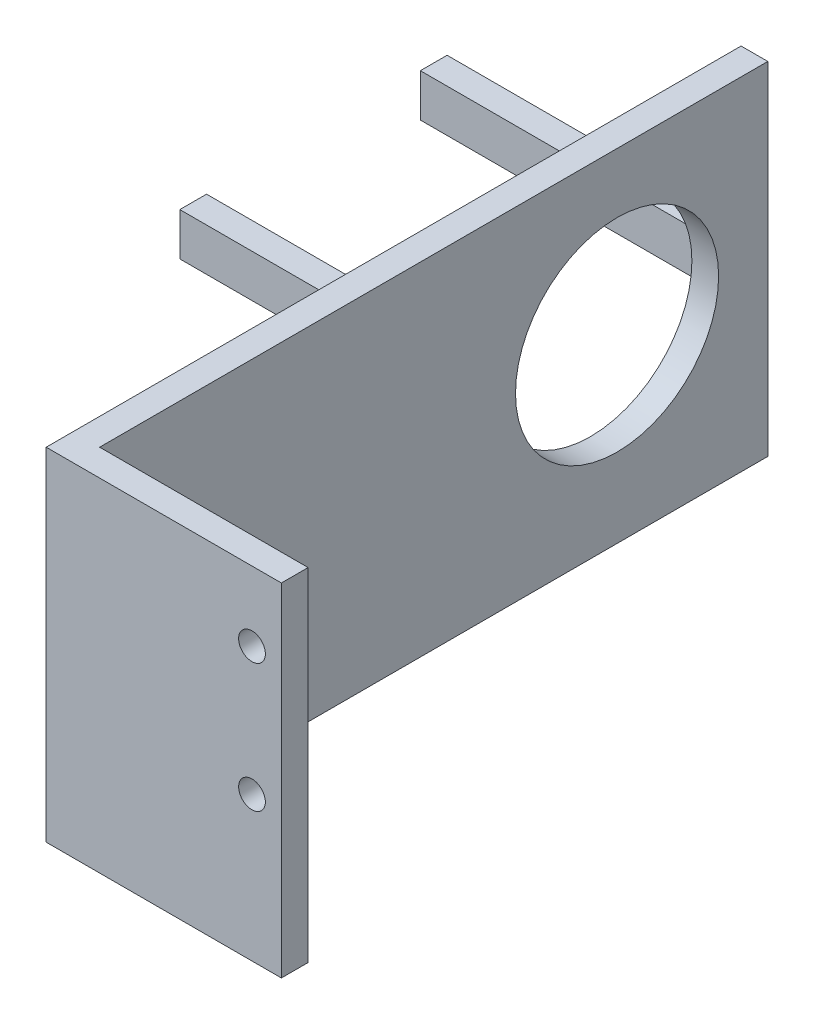
ISO-10303-21;
HEADER;
FILE_DESCRIPTION(('STEP AP214'),'2;1');
FILE_NAME('part.step','',(''),(''),'','','');
FILE_SCHEMA(('AUTOMOTIVE_DESIGN { 1 0 10303 214 1 1 1 1 }'));
ENDSEC;
DATA;
#1=APPLICATION_CONTEXT('core data for automotive mechanical design processes');
#2=APPLICATION_PROTOCOL_DEFINITION('international standard','automotive_design',2000,#1);
#3=PRODUCT_CONTEXT('',#1,'mechanical');
#4=PRODUCT('Part','Part','',(#3));
#5=PRODUCT_RELATED_PRODUCT_CATEGORY('part','',(#4));
#6=PRODUCT_DEFINITION_FORMATION('','',#4);
#7=PRODUCT_DEFINITION_CONTEXT('part definition',#1,'design');
#8=PRODUCT_DEFINITION('design','',#6,#7);
#9=PRODUCT_DEFINITION_SHAPE('','',#8);
#10=(LENGTH_UNIT() NAMED_UNIT(*) SI_UNIT(.MILLI.,.METRE.));
#11=(NAMED_UNIT(*) PLANE_ANGLE_UNIT() SI_UNIT($,.RADIAN.));
#12=(NAMED_UNIT(*) SI_UNIT($,.STERADIAN.) SOLID_ANGLE_UNIT());
#13=UNCERTAINTY_MEASURE_WITH_UNIT(LENGTH_MEASURE(1.E-05),#10,'distance_accuracy_value','');
#14=(GEOMETRIC_REPRESENTATION_CONTEXT(3) GLOBAL_UNCERTAINTY_ASSIGNED_CONTEXT((#13)) GLOBAL_UNIT_ASSIGNED_CONTEXT((#10,
#11,#12)) REPRESENTATION_CONTEXT('',''));
#15=CARTESIAN_POINT('',(0.,0.,0.));
#16=DIRECTION('',(0.,0.,1.));
#17=DIRECTION('',(1.,0.,0.));
#18=AXIS2_PLACEMENT_3D('',#15,#16,#17);
#19=CARTESIAN_POINT('',(-44.,64.,-125.));
#20=DIRECTION('',(-1.,0.,0.));
#21=DIRECTION('',(0.,-1.,0.));
#22=AXIS2_PLACEMENT_3D('',#19,#20,#21);
#23=PLANE('',#22);
#24=CARTESIAN_POINT('',(-44.,33.8,-96.8));
#25=DIRECTION('',(-1.,0.,0.));
#26=DIRECTION('',(0.,-1.,0.));
#27=AXIS2_PLACEMENT_3D('',#24,#25,#26);
#28=CIRCLE('',#27,19.);
#29=CARTESIAN_POINT('',(-44.,14.8,-96.8));
#30=VERTEX_POINT('',#29);
#31=EDGE_CURVE('E197',#30,#30,#28,.T.);
#32=ORIENTED_EDGE('',*,*,#31,.F.);
#33=EDGE_LOOP('',(#32));
#34=FACE_BOUND('',#33,.T.);
#35=DIRECTION('',(0.,-1.,0.));
#36=VECTOR('',#35,1.);
#37=CARTESIAN_POINT('',(-44.,64.,5.));
#38=LINE('',#37,#36);
#39=CARTESIAN_POINT('',(-44.,64.,5.));
#40=VERTEX_POINT('',#39);
#41=CARTESIAN_POINT('',(-44.,0.,5.));
#42=VERTEX_POINT('',#41);
#43=EDGE_CURVE('E203',#40,#42,#38,.T.);
#44=ORIENTED_EDGE('',*,*,#43,.F.);
#45=DIRECTION('',(0.,0.,1.));
#46=VECTOR('',#45,1.);
#47=CARTESIAN_POINT('',(-44.,64.,-125.));
#48=LINE('',#47,#46);
#49=CARTESIAN_POINT('',(-44.,64.,-125.));
#50=VERTEX_POINT('',#49);
#51=EDGE_CURVE('E226',#50,#40,#48,.T.);
#52=ORIENTED_EDGE('',*,*,#51,.F.);
#53=DIRECTION('',(0.,-1.,0.));
#54=VECTOR('',#53,1.);
#55=CARTESIAN_POINT('',(-44.,64.,-125.));
#56=LINE('',#55,#54);
#57=CARTESIAN_POINT('',(-44.,0.,-125.));
#58=VERTEX_POINT('',#57);
#59=EDGE_CURVE('E210',#50,#58,#56,.T.);
#60=ORIENTED_EDGE('',*,*,#59,.T.);
#61=DIRECTION('',(0.,0.,1.));
#62=VECTOR('',#61,1.);
#63=CARTESIAN_POINT('',(-44.,0.,-125.));
#64=LINE('',#63,#62);
#65=EDGE_CURVE('E223',#58,#42,#64,.T.);
#66=ORIENTED_EDGE('',*,*,#65,.T.);
#67=EDGE_LOOP('',(#44,#52,#60,#66));
#68=FACE_BOUND('',#67,.T.);
#69=DIRECTION('',(0.,0.,-1.));
#70=VECTOR('',#69,1.);
#71=CARTESIAN_POINT('',(-44.,38.0000000000007,-72.));
#72=LINE('',#71,#70);
#73=CARTESIAN_POINT('',(-44.,38.0000000000007,-72.));
#74=VERTEX_POINT('',#73);
#75=CARTESIAN_POINT('',(-44.,38.0000000000007,-77.));
#76=VERTEX_POINT('',#75);
#77=EDGE_CURVE('E169',#74,#76,#72,.T.);
#78=ORIENTED_EDGE('',*,*,#77,.F.);
#79=DIRECTION('',(0.,1.,0.));
#80=VECTOR('',#79,1.);
#81=CARTESIAN_POINT('',(-44.,38.0000000000007,-72.));
#82=LINE('',#81,#80);
#83=CARTESIAN_POINT('',(-44.,30.0000000000007,-72.));
#84=VERTEX_POINT('',#83);
#85=EDGE_CURVE('E166',#84,#74,#82,.T.);
#86=ORIENTED_EDGE('',*,*,#85,.F.);
#87=DIRECTION('',(0.,0.,1.));
#88=VECTOR('',#87,1.);
#89=CARTESIAN_POINT('',(-44.,30.0000000000007,-72.));
#90=LINE('',#89,#88);
#91=CARTESIAN_POINT('',(-44.,30.0000000000007,-77.));
#92=VERTEX_POINT('',#91);
#93=EDGE_CURVE('E178',#92,#84,#90,.T.);
#94=ORIENTED_EDGE('',*,*,#93,.F.);
#95=DIRECTION('',(0.,-1.,0.));
#96=VECTOR('',#95,1.);
#97=CARTESIAN_POINT('',(-44.,38.0000000000007,-77.));
#98=LINE('',#97,#96);
#99=EDGE_CURVE('E186',#76,#92,#98,.T.);
#100=ORIENTED_EDGE('',*,*,#99,.F.);
#101=EDGE_LOOP('',(#78,#86,#94,#100));
#102=FACE_BOUND('',#101,.T.);
#103=DIRECTION('',(0.,0.,1.));
#104=VECTOR('',#103,1.);
#105=CARTESIAN_POINT('',(-44.,30.0000000000007,-122.));
#106=LINE('',#105,#104);
#107=CARTESIAN_POINT('',(-44.,30.0000000000007,-122.));
#108=VERTEX_POINT('',#107);
#109=CARTESIAN_POINT('',(-44.,30.0000000000007,-117.));
#110=VERTEX_POINT('',#109);
#111=EDGE_CURVE('E497',#108,#110,#106,.T.);
#112=ORIENTED_EDGE('',*,*,#111,.F.);
#113=DIRECTION('',(0.,-1.,0.));
#114=VECTOR('',#113,1.);
#115=CARTESIAN_POINT('',(-44.,38.0000000000007,-122.));
#116=LINE('',#115,#114);
#117=CARTESIAN_POINT('',(-44.,38.0000000000007,-122.));
#118=VERTEX_POINT('',#117);
#119=EDGE_CURVE('E164',#118,#108,#116,.T.);
#120=ORIENTED_EDGE('',*,*,#119,.F.);
#121=DIRECTION('',(0.,0.,-1.));
#122=VECTOR('',#121,1.);
#123=CARTESIAN_POINT('',(-44.,38.0000000000007,-122.));
#124=LINE('',#123,#122);
#125=CARTESIAN_POINT('',(-44.,38.0000000000007,-117.));
#126=VERTEX_POINT('',#125);
#127=EDGE_CURVE('E160',#126,#118,#124,.T.);
#128=ORIENTED_EDGE('',*,*,#127,.F.);
#129=DIRECTION('',(0.,1.,0.));
#130=VECTOR('',#129,1.);
#131=CARTESIAN_POINT('',(-44.,38.0000000000007,-117.));
#132=LINE('',#131,#130);
#133=EDGE_CURVE('E494',#110,#126,#132,.T.);
#134=ORIENTED_EDGE('',*,*,#133,.F.);
#135=EDGE_LOOP('',(#112,#120,#128,#134));
#136=FACE_BOUND('',#135,.T.);
#137=ADVANCED_FACE('F39',(#34,#68,#102,#136),#23,.T.);
#138=CARTESIAN_POINT('',(0.,0.,5.));
#139=DIRECTION('',(0.,0.,1.));
#140=DIRECTION('',(1.,0.,0.));
#141=AXIS2_PLACEMENT_3D('',#138,#139,#140);
#142=PLANE('',#141);
#143=CARTESIAN_POINT('',(-5.5,51.,5.));
#144=DIRECTION('',(0.,0.,1.));
#145=DIRECTION('',(1.,0.,0.));
#146=AXIS2_PLACEMENT_3D('',#143,#144,#145);
#147=CIRCLE('',#146,2.5);
#148=CARTESIAN_POINT('',(-3.,51.,5.));
#149=VERTEX_POINT('',#148);
#150=EDGE_CURVE('E237',#149,#149,#147,.T.);
#151=ORIENTED_EDGE('',*,*,#150,.F.);
#152=EDGE_LOOP('',(#151));
#153=FACE_BOUND('',#152,.T.);
#154=DIRECTION('',(0.,1.,0.));
#155=VECTOR('',#154,1.);
#156=CARTESIAN_POINT('',(0.,0.,5.));
#157=LINE('',#156,#155);
#158=CARTESIAN_POINT('',(0.,0.,5.));
#159=VERTEX_POINT('',#158);
#160=CARTESIAN_POINT('',(0.,64.,5.));
#161=VERTEX_POINT('',#160);
#162=EDGE_CURVE('E243',#159,#161,#157,.T.);
#163=ORIENTED_EDGE('',*,*,#162,.T.);
#164=DIRECTION('',(-1.,0.,0.));
#165=VECTOR('',#164,1.);
#166=CARTESIAN_POINT('',(0.,64.,5.));
#167=LINE('',#166,#165);
#168=EDGE_CURVE('E246',#161,#40,#167,.T.);
#169=ORIENTED_EDGE('',*,*,#168,.T.);
#170=ORIENTED_EDGE('',*,*,#43,.T.);
#171=DIRECTION('',(1.,0.,0.));
#172=VECTOR('',#171,1.);
#173=CARTESIAN_POINT('',(0.,0.,5.));
#174=LINE('',#173,#172);
#175=EDGE_CURVE('E249',#42,#159,#174,.T.);
#176=ORIENTED_EDGE('',*,*,#175,.T.);
#177=EDGE_LOOP('',(#163,#169,#170,#176));
#178=FACE_BOUND('',#177,.T.);
#179=CARTESIAN_POINT('',(-5.5,27.,5.));
#180=DIRECTION('',(0.,0.,1.));
#181=DIRECTION('',(1.,0.,0.));
#182=AXIS2_PLACEMENT_3D('',#179,#180,#181);
#183=CIRCLE('',#182,2.5);
#184=CARTESIAN_POINT('',(-3.,27.,5.));
#185=VERTEX_POINT('',#184);
#186=EDGE_CURVE('E231',#185,#185,#183,.T.);
#187=ORIENTED_EDGE('',*,*,#186,.F.);
#188=EDGE_LOOP('',(#187));
#189=FACE_BOUND('',#188,.T.);
#190=ADVANCED_FACE('F273',(#153,#178,#189),#142,.T.);
#191=CARTESIAN_POINT('',(0.,0.,0.));
#192=DIRECTION('',(0.,0.,1.));
#193=DIRECTION('',(1.,0.,0.));
#194=AXIS2_PLACEMENT_3D('',#191,#192,#193);
#195=PLANE('',#194);
#196=DIRECTION('',(0.,1.,0.));
#197=VECTOR('',#196,1.);
#198=CARTESIAN_POINT('',(0.,0.,0.));
#199=LINE('',#198,#197);
#200=CARTESIAN_POINT('',(0.,0.,0.));
#201=VERTEX_POINT('',#200);
#202=CARTESIAN_POINT('',(0.,64.,0.));
#203=VERTEX_POINT('',#202);
#204=EDGE_CURVE('E240',#201,#203,#199,.T.);
#205=ORIENTED_EDGE('',*,*,#204,.F.);
#206=DIRECTION('',(1.,0.,0.));
#207=VECTOR('',#206,1.);
#208=CARTESIAN_POINT('',(0.,0.,0.));
#209=LINE('',#208,#207);
#210=CARTESIAN_POINT('',(-39.,0.,0.));
#211=VERTEX_POINT('',#210);
#212=EDGE_CURVE('E247',#211,#201,#209,.T.);
#213=ORIENTED_EDGE('',*,*,#212,.F.);
#214=DIRECTION('',(0.,-1.,0.));
#215=VECTOR('',#214,1.);
#216=CARTESIAN_POINT('',(-39.,0.,0.));
#217=LINE('',#216,#215);
#218=CARTESIAN_POINT('',(-39.,64.,0.));
#219=VERTEX_POINT('',#218);
#220=EDGE_CURVE('E255',#219,#211,#217,.T.);
#221=ORIENTED_EDGE('',*,*,#220,.F.);
#222=DIRECTION('',(-1.,0.,0.));
#223=VECTOR('',#222,1.);
#224=CARTESIAN_POINT('',(0.,64.,0.));
#225=LINE('',#224,#223);
#226=EDGE_CURVE('E253',#203,#219,#225,.T.);
#227=ORIENTED_EDGE('',*,*,#226,.F.);
#228=EDGE_LOOP('',(#205,#213,#221,#227));
#229=FACE_BOUND('',#228,.T.);
#230=CARTESIAN_POINT('',(-5.5,51.,0.));
#231=DIRECTION('',(0.,0.,1.));
#232=DIRECTION('',(1.,0.,0.));
#233=AXIS2_PLACEMENT_3D('',#230,#231,#232);
#234=CIRCLE('',#233,2.5);
#235=CARTESIAN_POINT('',(-3.,51.,0.));
#236=VERTEX_POINT('',#235);
#237=EDGE_CURVE('E234',#236,#236,#234,.T.);
#238=ORIENTED_EDGE('',*,*,#237,.T.);
#239=EDGE_LOOP('',(#238));
#240=FACE_BOUND('',#239,.T.);
#241=CARTESIAN_POINT('',(-5.5,27.,0.));
#242=DIRECTION('',(0.,0.,1.));
#243=DIRECTION('',(1.,0.,0.));
#244=AXIS2_PLACEMENT_3D('',#241,#242,#243);
#245=CIRCLE('',#244,2.5);
#246=CARTESIAN_POINT('',(-3.,27.,0.));
#247=VERTEX_POINT('',#246);
#248=EDGE_CURVE('E222',#247,#247,#245,.T.);
#249=ORIENTED_EDGE('',*,*,#248,.T.);
#250=EDGE_LOOP('',(#249));
#251=FACE_BOUND('',#250,.T.);
#252=ADVANCED_FACE('F266',(#229,#240,#251),#195,.F.);
#253=CARTESIAN_POINT('',(0.,0.,5.));
#254=DIRECTION('',(-1.,0.,0.));
#255=DIRECTION('',(0.,0.,1.));
#256=AXIS2_PLACEMENT_3D('',#253,#254,#255);
#257=PLANE('',#256);
#258=ORIENTED_EDGE('',*,*,#204,.T.);
#259=DIRECTION('',(0.,0.,-1.));
#260=VECTOR('',#259,1.);
#261=CARTESIAN_POINT('',(0.,64.,5.));
#262=LINE('',#261,#260);
#263=EDGE_CURVE('E11',#161,#203,#262,.T.);
#264=ORIENTED_EDGE('',*,*,#263,.F.);
#265=ORIENTED_EDGE('',*,*,#162,.F.);
#266=DIRECTION('',(0.,0.,-1.));
#267=VECTOR('',#266,1.);
#268=CARTESIAN_POINT('',(0.,0.,5.));
#269=LINE('',#268,#267);
#270=EDGE_CURVE('E47',#159,#201,#269,.T.);
#271=ORIENTED_EDGE('',*,*,#270,.T.);
#272=EDGE_LOOP('',(#258,#264,#265,#271));
#273=FACE_BOUND('',#272,.T.);
#274=ADVANCED_FACE('F41',(#273),#257,.F.);
#275=CARTESIAN_POINT('',(0.,64.,5.));
#276=DIRECTION('',(0.,-1.,0.));
#277=DIRECTION('',(0.,0.,-1.));
#278=AXIS2_PLACEMENT_3D('',#275,#276,#277);
#279=PLANE('',#278);
#280=ORIENTED_EDGE('',*,*,#226,.T.);
#281=DIRECTION('',(0.,0.,1.));
#282=VECTOR('',#281,1.);
#283=CARTESIAN_POINT('',(-39.,64.,-125.));
#284=LINE('',#283,#282);
#285=CARTESIAN_POINT('',(-39.,64.,-125.));
#286=VERTEX_POINT('',#285);
#287=EDGE_CURVE('E216',#286,#219,#284,.T.);
#288=ORIENTED_EDGE('',*,*,#287,.F.);
#289=DIRECTION('',(-1.,0.,0.));
#290=VECTOR('',#289,1.);
#291=CARTESIAN_POINT('',(-39.,64.,-125.));
#292=LINE('',#291,#290);
#293=EDGE_CURVE('E207',#286,#50,#292,.T.);
#294=ORIENTED_EDGE('',*,*,#293,.T.);
#295=ORIENTED_EDGE('',*,*,#51,.T.);
#296=ORIENTED_EDGE('',*,*,#168,.F.);
#297=ORIENTED_EDGE('',*,*,#263,.T.);
#298=EDGE_LOOP('',(#280,#288,#294,#295,#296,#297));
#299=FACE_BOUND('',#298,.T.);
#300=ADVANCED_FACE('F270',(#299),#279,.F.);
#301=CARTESIAN_POINT('',(0.,0.,5.));
#302=DIRECTION('',(0.,1.,0.));
#303=DIRECTION('',(-1.,0.,0.));
#304=AXIS2_PLACEMENT_3D('',#301,#302,#303);
#305=PLANE('',#304);
#306=ORIENTED_EDGE('',*,*,#212,.T.);
#307=ORIENTED_EDGE('',*,*,#270,.F.);
#308=ORIENTED_EDGE('',*,*,#175,.F.);
#309=ORIENTED_EDGE('',*,*,#65,.F.);
#310=DIRECTION('',(1.,0.,0.));
#311=VECTOR('',#310,1.);
#312=CARTESIAN_POINT('',(-39.,0.,-125.));
#313=LINE('',#312,#311);
#314=CARTESIAN_POINT('',(-39.,0.,-125.));
#315=VERTEX_POINT('',#314);
#316=EDGE_CURVE('E213',#58,#315,#313,.T.);
#317=ORIENTED_EDGE('',*,*,#316,.T.);
#318=DIRECTION('',(0.,0.,1.));
#319=VECTOR('',#318,1.);
#320=CARTESIAN_POINT('',(-39.,0.,-125.));
#321=LINE('',#320,#319);
#322=EDGE_CURVE('E219',#315,#211,#321,.T.);
#323=ORIENTED_EDGE('',*,*,#322,.T.);
#324=EDGE_LOOP('',(#306,#307,#308,#309,#317,#323));
#325=FACE_BOUND('',#324,.T.);
#326=ADVANCED_FACE('F275',(#325),#305,.F.);
#327=CARTESIAN_POINT('',(-5.5,51.,5.));
#328=DIRECTION('',(0.,0.,-1.));
#329=DIRECTION('',(-1.,0.,0.));
#330=AXIS2_PLACEMENT_3D('',#327,#328,#329);
#331=CYLINDRICAL_SURFACE('',#330,2.5);
#332=ORIENTED_EDGE('',*,*,#150,.T.);
#333=EDGE_LOOP('',(#332));
#334=FACE_BOUND('',#333,.T.);
#335=ORIENTED_EDGE('',*,*,#237,.F.);
#336=EDGE_LOOP('',(#335));
#337=FACE_BOUND('',#336,.T.);
#338=ADVANCED_FACE('F298',(#334,#337),#331,.F.);
#339=CARTESIAN_POINT('',(-5.5,27.,5.));
#340=DIRECTION('',(0.,0.,-1.));
#341=DIRECTION('',(-1.,0.,0.));
#342=AXIS2_PLACEMENT_3D('',#339,#340,#341);
#343=CYLINDRICAL_SURFACE('',#342,2.5);
#344=ORIENTED_EDGE('',*,*,#186,.T.);
#345=EDGE_LOOP('',(#344));
#346=FACE_BOUND('',#345,.T.);
#347=ORIENTED_EDGE('',*,*,#248,.F.);
#348=EDGE_LOOP('',(#347));
#349=FACE_BOUND('',#348,.T.);
#350=ADVANCED_FACE('F287',(#346,#349),#343,.F.);
#351=CARTESIAN_POINT('',(-39.,64.,-125.));
#352=DIRECTION('',(1.,0.,0.));
#353=DIRECTION('',(0.,0.,-1.));
#354=AXIS2_PLACEMENT_3D('',#351,#352,#353);
#355=PLANE('',#354);
#356=CARTESIAN_POINT('',(-39.,33.8,-96.8));
#357=DIRECTION('',(1.,0.,0.));
#358=DIRECTION('',(0.,0.,-1.));
#359=AXIS2_PLACEMENT_3D('',#356,#357,#358);
#360=CIRCLE('',#359,19.);
#361=CARTESIAN_POINT('',(-39.,33.8,-115.8));
#362=VERTEX_POINT('',#361);
#363=EDGE_CURVE('E200',#362,#362,#360,.T.);
#364=ORIENTED_EDGE('',*,*,#363,.F.);
#365=EDGE_LOOP('',(#364));
#366=FACE_BOUND('',#365,.T.);
#367=ORIENTED_EDGE('',*,*,#287,.T.);
#368=ORIENTED_EDGE('',*,*,#220,.T.);
#369=ORIENTED_EDGE('',*,*,#322,.F.);
#370=DIRECTION('',(0.,1.,0.));
#371=VECTOR('',#370,1.);
#372=CARTESIAN_POINT('',(-39.,64.,-125.));
#373=LINE('',#372,#371);
#374=EDGE_CURVE('E204',#315,#286,#373,.T.);
#375=ORIENTED_EDGE('',*,*,#374,.T.);
#376=EDGE_LOOP('',(#367,#368,#369,#375));
#377=FACE_BOUND('',#376,.T.);
#378=ADVANCED_FACE('F285',(#366,#377),#355,.T.);
#379=CARTESIAN_POINT('',(0.,0.,-125.));
#380=DIRECTION('',(0.,0.,-1.));
#381=DIRECTION('',(-1.,0.,0.));
#382=AXIS2_PLACEMENT_3D('',#379,#380,#381);
#383=PLANE('',#382);
#384=ORIENTED_EDGE('',*,*,#374,.F.);
#385=ORIENTED_EDGE('',*,*,#316,.F.);
#386=ORIENTED_EDGE('',*,*,#59,.F.);
#387=ORIENTED_EDGE('',*,*,#293,.F.);
#388=EDGE_LOOP('',(#384,#385,#386,#387));
#389=FACE_BOUND('',#388,.T.);
#390=ADVANCED_FACE('F283',(#389),#383,.T.);
#391=CARTESIAN_POINT('',(0.,33.8,-96.8));
#392=DIRECTION('',(-1.,0.,0.));
#393=DIRECTION('',(0.,-1.,0.));
#394=AXIS2_PLACEMENT_3D('',#391,#392,#393);
#395=CYLINDRICAL_SURFACE('',#394,19.);
#396=ORIENTED_EDGE('',*,*,#363,.T.);
#397=EDGE_LOOP('',(#396));
#398=FACE_BOUND('',#397,.T.);
#399=ORIENTED_EDGE('',*,*,#31,.T.);
#400=EDGE_LOOP('',(#399));
#401=FACE_BOUND('',#400,.T.);
#402=ADVANCED_FACE('F295',(#398,#401),#395,.F.);
#403=CARTESIAN_POINT('',(-96.,38.0000000000007,-72.));
#404=DIRECTION('',(0.,0.,-1.));
#405=DIRECTION('',(-1.,0.,0.));
#406=AXIS2_PLACEMENT_3D('',#403,#404,#405);
#407=PLANE('',#406);
#408=ORIENTED_EDGE('',*,*,#85,.T.);
#409=DIRECTION('',(1.,0.,0.));
#410=VECTOR('',#409,1.);
#411=CARTESIAN_POINT('',(-96.,38.0000000000007,-72.));
#412=LINE('',#411,#410);
#413=CARTESIAN_POINT('',(-96.,38.0000000000007,-72.));
#414=VERTEX_POINT('',#413);
#415=EDGE_CURVE('E195',#414,#74,#412,.T.);
#416=ORIENTED_EDGE('',*,*,#415,.F.);
#417=DIRECTION('',(0.,1.,0.));
#418=VECTOR('',#417,1.);
#419=CARTESIAN_POINT('',(-96.,38.0000000000007,-72.));
#420=LINE('',#419,#418);
#421=CARTESIAN_POINT('',(-96.,30.0000000000007,-72.));
#422=VERTEX_POINT('',#421);
#423=EDGE_CURVE('E174',#422,#414,#420,.T.);
#424=ORIENTED_EDGE('',*,*,#423,.F.);
#425=DIRECTION('',(1.,0.,0.));
#426=VECTOR('',#425,1.);
#427=CARTESIAN_POINT('',(-96.,30.0000000000007,-72.));
#428=LINE('',#427,#426);
#429=EDGE_CURVE('E183',#422,#84,#428,.T.);
#430=ORIENTED_EDGE('',*,*,#429,.T.);
#431=EDGE_LOOP('',(#408,#416,#424,#430));
#432=FACE_BOUND('',#431,.T.);
#433=ADVANCED_FACE('F315',(#432),#407,.F.);
#434=CARTESIAN_POINT('',(-96.,38.0000000000007,-72.));
#435=DIRECTION('',(0.,-1.,0.));
#436=DIRECTION('',(1.,0.,0.));
#437=AXIS2_PLACEMENT_3D('',#434,#435,#436);
#438=PLANE('',#437);
#439=ORIENTED_EDGE('',*,*,#77,.T.);
#440=DIRECTION('',(1.,0.,0.));
#441=VECTOR('',#440,1.);
#442=CARTESIAN_POINT('',(-96.,38.0000000000007,-77.));
#443=LINE('',#442,#441);
#444=CARTESIAN_POINT('',(-96.,38.0000000000007,-77.));
#445=VERTEX_POINT('',#444);
#446=EDGE_CURVE('E192',#445,#76,#443,.T.);
#447=ORIENTED_EDGE('',*,*,#446,.F.);
#448=DIRECTION('',(0.,0.,-1.));
#449=VECTOR('',#448,1.);
#450=CARTESIAN_POINT('',(-96.,38.0000000000007,-72.));
#451=LINE('',#450,#449);
#452=EDGE_CURVE('E177',#414,#445,#451,.T.);
#453=ORIENTED_EDGE('',*,*,#452,.F.);
#454=ORIENTED_EDGE('',*,*,#415,.T.);
#455=EDGE_LOOP('',(#439,#447,#453,#454));
#456=FACE_BOUND('',#455,.T.);
#457=ADVANCED_FACE('F319',(#456),#438,.F.);
#458=CARTESIAN_POINT('',(-96.,38.0000000000007,-77.));
#459=DIRECTION('',(0.,0.,1.));
#460=DIRECTION('',(1.,0.,0.));
#461=AXIS2_PLACEMENT_3D('',#458,#459,#460);
#462=PLANE('',#461);
#463=ORIENTED_EDGE('',*,*,#99,.T.);
#464=DIRECTION('',(1.,0.,0.));
#465=VECTOR('',#464,1.);
#466=CARTESIAN_POINT('',(-96.,30.0000000000007,-77.));
#467=LINE('',#466,#465);
#468=CARTESIAN_POINT('',(-96.,30.0000000000007,-77.));
#469=VERTEX_POINT('',#468);
#470=EDGE_CURVE('E62',#469,#92,#467,.T.);
#471=ORIENTED_EDGE('',*,*,#470,.F.);
#472=DIRECTION('',(0.,-1.,0.));
#473=VECTOR('',#472,1.);
#474=CARTESIAN_POINT('',(-96.,38.0000000000007,-77.));
#475=LINE('',#474,#473);
#476=EDGE_CURVE('E180',#445,#469,#475,.T.);
#477=ORIENTED_EDGE('',*,*,#476,.F.);
#478=ORIENTED_EDGE('',*,*,#446,.T.);
#479=EDGE_LOOP('',(#463,#471,#477,#478));
#480=FACE_BOUND('',#479,.T.);
#481=ADVANCED_FACE('F323',(#480),#462,.F.);
#482=CARTESIAN_POINT('',(-96.,30.0000000000007,-72.));
#483=DIRECTION('',(0.,1.,0.));
#484=DIRECTION('',(-1.,0.,0.));
#485=AXIS2_PLACEMENT_3D('',#482,#483,#484);
#486=PLANE('',#485);
#487=ORIENTED_EDGE('',*,*,#93,.T.);
#488=ORIENTED_EDGE('',*,*,#429,.F.);
#489=DIRECTION('',(0.,0.,1.));
#490=VECTOR('',#489,1.);
#491=CARTESIAN_POINT('',(-96.,30.0000000000007,-72.));
#492=LINE('',#491,#490);
#493=EDGE_CURVE('E182',#469,#422,#492,.T.);
#494=ORIENTED_EDGE('',*,*,#493,.F.);
#495=ORIENTED_EDGE('',*,*,#470,.T.);
#496=EDGE_LOOP('',(#487,#488,#494,#495));
#497=FACE_BOUND('',#496,.T.);
#498=ADVANCED_FACE('F327',(#497),#486,.F.);
#499=CARTESIAN_POINT('',(-96.,0.,0.));
#500=DIRECTION('',(1.,0.,0.));
#501=DIRECTION('',(0.,1.,0.));
#502=AXIS2_PLACEMENT_3D('',#499,#500,#501);
#503=PLANE('',#502);
#504=ORIENTED_EDGE('',*,*,#423,.T.);
#505=ORIENTED_EDGE('',*,*,#452,.T.);
#506=ORIENTED_EDGE('',*,*,#476,.T.);
#507=ORIENTED_EDGE('',*,*,#493,.T.);
#508=EDGE_LOOP('',(#504,#505,#506,#507));
#509=FACE_BOUND('',#508,.T.);
#510=ADVANCED_FACE('F331',(#509),#503,.F.);
#511=CARTESIAN_POINT('',(-96.,38.0000000000007,-122.));
#512=DIRECTION('',(0.,0.,1.));
#513=DIRECTION('',(1.,0.,0.));
#514=AXIS2_PLACEMENT_3D('',#511,#512,#513);
#515=PLANE('',#514);
#516=ORIENTED_EDGE('',*,*,#119,.T.);
#517=DIRECTION('',(1.,0.,0.));
#518=VECTOR('',#517,1.);
#519=CARTESIAN_POINT('',(-96.,30.0000000000007,-122.));
#520=LINE('',#519,#518);
#521=CARTESIAN_POINT('',(-96.,30.0000000000007,-122.));
#522=VERTEX_POINT('',#521);
#523=EDGE_CURVE('E145',#522,#108,#520,.T.);
#524=ORIENTED_EDGE('',*,*,#523,.F.);
#525=DIRECTION('',(0.,-1.,0.));
#526=VECTOR('',#525,1.);
#527=CARTESIAN_POINT('',(-96.,38.0000000000007,-122.));
#528=LINE('',#527,#526);
#529=CARTESIAN_POINT('',(-96.,38.0000000000007,-122.));
#530=VERTEX_POINT('',#529);
#531=EDGE_CURVE('E152',#530,#522,#528,.T.);
#532=ORIENTED_EDGE('',*,*,#531,.F.);
#533=DIRECTION('',(1.,0.,0.));
#534=VECTOR('',#533,1.);
#535=CARTESIAN_POINT('',(-96.,38.0000000000007,-122.));
#536=LINE('',#535,#534);
#537=EDGE_CURVE('E491',#530,#118,#536,.T.);
#538=ORIENTED_EDGE('',*,*,#537,.T.);
#539=EDGE_LOOP('',(#516,#524,#532,#538));
#540=FACE_BOUND('',#539,.T.);
#541=ADVANCED_FACE('F162',(#540),#515,.F.);
#542=CARTESIAN_POINT('',(-96.,30.0000000000007,-122.));
#543=DIRECTION('',(0.,1.,0.));
#544=DIRECTION('',(-1.,0.,0.));
#545=AXIS2_PLACEMENT_3D('',#542,#543,#544);
#546=PLANE('',#545);
#547=ORIENTED_EDGE('',*,*,#111,.T.);
#548=DIRECTION('',(1.,0.,0.));
#549=VECTOR('',#548,1.);
#550=CARTESIAN_POINT('',(-96.,30.0000000000007,-117.));
#551=LINE('',#550,#549);
#552=CARTESIAN_POINT('',(-96.,30.0000000000007,-117.));
#553=VERTEX_POINT('',#552);
#554=EDGE_CURVE('E148',#553,#110,#551,.T.);
#555=ORIENTED_EDGE('',*,*,#554,.F.);
#556=DIRECTION('',(0.,0.,1.));
#557=VECTOR('',#556,1.);
#558=CARTESIAN_POINT('',(-96.,30.0000000000007,-122.));
#559=LINE('',#558,#557);
#560=EDGE_CURVE('E141',#522,#553,#559,.T.);
#561=ORIENTED_EDGE('',*,*,#560,.F.);
#562=ORIENTED_EDGE('',*,*,#523,.T.);
#563=EDGE_LOOP('',(#547,#555,#561,#562));
#564=FACE_BOUND('',#563,.T.);
#565=ADVANCED_FACE('F143',(#564),#546,.F.);
#566=CARTESIAN_POINT('',(-96.,38.0000000000007,-117.));
#567=DIRECTION('',(0.,0.,-1.));
#568=DIRECTION('',(-1.,0.,0.));
#569=AXIS2_PLACEMENT_3D('',#566,#567,#568);
#570=PLANE('',#569);
#571=ORIENTED_EDGE('',*,*,#133,.T.);
#572=DIRECTION('',(1.,0.,0.));
#573=VECTOR('',#572,1.);
#574=CARTESIAN_POINT('',(-96.,38.0000000000007,-117.));
#575=LINE('',#574,#573);
#576=CARTESIAN_POINT('',(-96.,38.0000000000007,-117.));
#577=VERTEX_POINT('',#576);
#578=EDGE_CURVE('E54',#577,#126,#575,.T.);
#579=ORIENTED_EDGE('',*,*,#578,.F.);
#580=DIRECTION('',(0.,1.,0.));
#581=VECTOR('',#580,1.);
#582=CARTESIAN_POINT('',(-96.,38.0000000000007,-117.));
#583=LINE('',#582,#581);
#584=EDGE_CURVE('E151',#553,#577,#583,.T.);
#585=ORIENTED_EDGE('',*,*,#584,.F.);
#586=ORIENTED_EDGE('',*,*,#554,.T.);
#587=EDGE_LOOP('',(#571,#579,#585,#586));
#588=FACE_BOUND('',#587,.T.);
#589=ADVANCED_FACE('F339',(#588),#570,.F.);
#590=CARTESIAN_POINT('',(-96.,38.0000000000007,-122.));
#591=DIRECTION('',(0.,-1.,0.));
#592=DIRECTION('',(1.,0.,0.));
#593=AXIS2_PLACEMENT_3D('',#590,#591,#592);
#594=PLANE('',#593);
#595=ORIENTED_EDGE('',*,*,#127,.T.);
#596=ORIENTED_EDGE('',*,*,#537,.F.);
#597=DIRECTION('',(0.,0.,-1.));
#598=VECTOR('',#597,1.);
#599=CARTESIAN_POINT('',(-96.,38.0000000000007,-122.));
#600=LINE('',#599,#598);
#601=EDGE_CURVE('E156',#577,#530,#600,.T.);
#602=ORIENTED_EDGE('',*,*,#601,.F.);
#603=ORIENTED_EDGE('',*,*,#578,.T.);
#604=EDGE_LOOP('',(#595,#596,#602,#603));
#605=FACE_BOUND('',#604,.T.);
#606=ADVANCED_FACE('F342',(#605),#594,.F.);
#607=CARTESIAN_POINT('',(-96.,0.,0.));
#608=DIRECTION('',(-1.,0.,0.));
#609=DIRECTION('',(0.,-1.,0.));
#610=AXIS2_PLACEMENT_3D('',#607,#608,#609);
#611=PLANE('',#610);
#612=ORIENTED_EDGE('',*,*,#531,.T.);
#613=ORIENTED_EDGE('',*,*,#560,.T.);
#614=ORIENTED_EDGE('',*,*,#584,.T.);
#615=ORIENTED_EDGE('',*,*,#601,.T.);
#616=EDGE_LOOP('',(#612,#613,#614,#615));
#617=FACE_BOUND('',#616,.T.);
#618=ADVANCED_FACE('F155',(#617),#611,.T.);
#619=CLOSED_SHELL('',(#137,#190,#252,#274,#300,#326,#338,#350,#378,#390,#402,#433,#457,#481,
#498,#510,#541,#565,#589,#606,#618));
#620=MANIFOLD_SOLID_BREP('B2',#619);
#621=ADVANCED_BREP_SHAPE_REPRESENTATION('',(#18,#620),#14);
#622=SHAPE_DEFINITION_REPRESENTATION(#9,#621);
ENDSEC;
END-ISO-10303-21;
